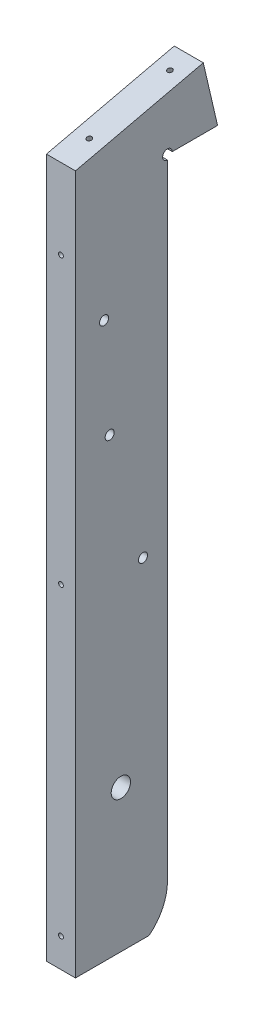
ISO-10303-21;
HEADER;
FILE_DESCRIPTION(('STEP AP214'),'2;1');
FILE_NAME('part.step','',(''),(''),'','','');
FILE_SCHEMA(('AUTOMOTIVE_DESIGN { 1 0 10303 214 1 1 1 1 }'));
ENDSEC;
DATA;
#1=APPLICATION_CONTEXT('core data for automotive mechanical design processes');
#2=APPLICATION_PROTOCOL_DEFINITION('international standard','automotive_design',2000,#1);
#3=PRODUCT_CONTEXT('',#1,'mechanical');
#4=PRODUCT('Part','Part','',(#3));
#5=PRODUCT_RELATED_PRODUCT_CATEGORY('part','',(#4));
#6=PRODUCT_DEFINITION_FORMATION('','',#4);
#7=PRODUCT_DEFINITION_CONTEXT('part definition',#1,'design');
#8=PRODUCT_DEFINITION('design','',#6,#7);
#9=PRODUCT_DEFINITION_SHAPE('','',#8);
#10=(LENGTH_UNIT() NAMED_UNIT(*) SI_UNIT(.MILLI.,.METRE.));
#11=(NAMED_UNIT(*) PLANE_ANGLE_UNIT() SI_UNIT($,.RADIAN.));
#12=(NAMED_UNIT(*) SI_UNIT($,.STERADIAN.) SOLID_ANGLE_UNIT());
#13=UNCERTAINTY_MEASURE_WITH_UNIT(LENGTH_MEASURE(1.E-05),#10,'distance_accuracy_value','');
#14=(GEOMETRIC_REPRESENTATION_CONTEXT(3) GLOBAL_UNCERTAINTY_ASSIGNED_CONTEXT((#13)) GLOBAL_UNIT_ASSIGNED_CONTEXT((#10,
#11,#12)) REPRESENTATION_CONTEXT('',''));
#15=CARTESIAN_POINT('',(0.,0.,0.));
#16=DIRECTION('',(0.,0.,1.));
#17=DIRECTION('',(1.,0.,0.));
#18=AXIS2_PLACEMENT_3D('',#15,#16,#17);
#19=CARTESIAN_POINT('',(-228.088766336441,1.77635683940025E-12,-66.675));
#20=DIRECTION('',(1.,0.,0.));
#21=DIRECTION('',(0.,1.,0.));
#22=AXIS2_PLACEMENT_3D('',#19,#20,#21);
#23=PLANE('',#22);
#24=DIRECTION('',(0.,-1.,0.));
#25=VECTOR('',#24,1.);
#26=CARTESIAN_POINT('',(-228.088766336441,1.77635683940025E-12,0.));
#27=LINE('',#26,#25);
#28=CARTESIAN_POINT('',(-228.088766336441,20.8246330030021,0.));
#29=VERTEX_POINT('',#28);
#30=CARTESIAN_POINT('',(-228.088766336441,-437.642,0.));
#31=VERTEX_POINT('',#30);
#32=EDGE_CURVE('E128',#29,#31,#27,.T.);
#33=ORIENTED_EDGE('',*,*,#32,.F.);
#34=DIRECTION('',(0.,-0.22637333895091,0.974040610761285));
#35=VECTOR('',#34,1.);
#36=CARTESIAN_POINT('',(-228.088766336441,34.8445532417902,-60.325));
#37=LINE('',#36,#35);
#38=CARTESIAN_POINT('',(-228.088766336441,40.3069419106757,-83.8285999376698));
#39=VERTEX_POINT('',#38);
#40=EDGE_CURVE('E210',#39,#29,#37,.T.);
#41=ORIENTED_EDGE('',*,*,#40,.F.);
#42=DIRECTION('',(0.,0.974040610761285,0.226373338950907));
#43=VECTOR('',#42,1.);
#44=CARTESIAN_POINT('',(-228.088766336441,40.3069419106757,-83.8285999376698));
#45=LINE('',#44,#43);
#46=CARTESIAN_POINT('',(-228.088766336441,0.,-93.1961939808879));
#47=VERTEX_POINT('',#46);
#48=EDGE_CURVE('E201',#47,#39,#45,.T.);
#49=ORIENTED_EDGE('',*,*,#48,.F.);
#50=DIRECTION('',(0.,0.,-1.));
#51=VECTOR('',#50,1.);
#52=CARTESIAN_POINT('',(-228.088766336441,0.,-93.1961939808879));
#53=LINE('',#52,#51);
#54=CARTESIAN_POINT('',(-228.088766336441,0.,-63.5));
#55=VERTEX_POINT('',#54);
#56=EDGE_CURVE('E196',#55,#47,#53,.T.);
#57=ORIENTED_EDGE('',*,*,#56,.F.);
#58=CARTESIAN_POINT('',(-228.088766336441,0.,-60.325));
#59=DIRECTION('',(1.,0.,0.));
#60=DIRECTION('',(0.,0.,-1.));
#61=AXIS2_PLACEMENT_3D('',#58,#59,#60);
#62=CIRCLE('',#61,3.175);
#63=CARTESIAN_POINT('',(-228.088766336441,-3.17500000000002,-60.325));
#64=VERTEX_POINT('',#63);
#65=EDGE_CURVE('E151',#55,#64,#62,.T.);
#66=ORIENTED_EDGE('',*,*,#65,.T.);
#67=DIRECTION('',(0.,-1.,0.));
#68=VECTOR('',#67,1.);
#69=CARTESIAN_POINT('',(-228.088766336441,1.77635683940025E-12,-60.325));
#70=LINE('',#69,#68);
#71=CARTESIAN_POINT('',(-228.088766336441,-412.75,-60.325));
#72=VERTEX_POINT('',#71);
#73=EDGE_CURVE('E222',#64,#72,#70,.T.);
#74=ORIENTED_EDGE('',*,*,#73,.T.);
#75=CARTESIAN_POINT('',(-228.088766336441,-412.75,-28.575));
#76=DIRECTION('',(-1.,0.,0.));
#77=DIRECTION('',(0.,-1.,0.));
#78=AXIS2_PLACEMENT_3D('',#75,#76,#77);
#79=CIRCLE('',#78,31.75);
#80=CARTESIAN_POINT('',(-228.088766336441,-437.642,-48.2841561463194));
#81=VERTEX_POINT('',#80);
#82=EDGE_CURVE('E225',#72,#81,#79,.T.);
#83=ORIENTED_EDGE('',*,*,#82,.T.);
#84=DIRECTION('',(0.,0.,1.));
#85=VECTOR('',#84,1.);
#86=CARTESIAN_POINT('',(-228.088766336441,-437.642,0.));
#87=LINE('',#86,#85);
#88=EDGE_CURVE('E137',#81,#31,#87,.T.);
#89=ORIENTED_EDGE('',*,*,#88,.T.);
#90=EDGE_LOOP('',(#33,#41,#49,#57,#66,#74,#83,#89));
#91=FACE_BOUND('',#90,.T.);
#92=CARTESIAN_POINT('',(-228.088766336441,-73.4835711186936,-18.7555467062765));
#93=DIRECTION('',(1.,0.,0.));
#94=DIRECTION('',(0.,0.,-1.));
#95=AXIS2_PLACEMENT_3D('',#92,#93,#94);
#96=CIRCLE('',#95,2.976626);
#97=CARTESIAN_POINT('',(-228.088766336441,-73.4835711186936,-21.7321727062765));
#98=VERTEX_POINT('',#97);
#99=EDGE_CURVE('E251',#98,#98,#96,.T.);
#100=ORIENTED_EDGE('',*,*,#99,.T.);
#101=EDGE_LOOP('',(#100));
#102=FACE_BOUND('',#101,.T.);
#103=CARTESIAN_POINT('',(-228.088766336441,-140.390130184137,-22.4342058235592));
#104=DIRECTION('',(1.,0.,0.));
#105=DIRECTION('',(0.,0.,-1.));
#106=AXIS2_PLACEMENT_3D('',#103,#104,#105);
#107=CIRCLE('',#106,2.97662600000001);
#108=CARTESIAN_POINT('',(-228.088766336441,-140.390130184137,-25.4108318235592));
#109=VERTEX_POINT('',#108);
#110=EDGE_CURVE('E259',#109,#109,#107,.T.);
#111=ORIENTED_EDGE('',*,*,#110,.T.);
#112=EDGE_LOOP('',(#111));
#113=FACE_BOUND('',#112,.T.);
#114=CARTESIAN_POINT('',(-228.088766336441,-221.06944442262,-44.3140248027106));
#115=DIRECTION('',(1.,0.,0.));
#116=DIRECTION('',(0.,0.,-1.));
#117=AXIS2_PLACEMENT_3D('',#114,#115,#116);
#118=CIRCLE('',#117,2.97662600000001);
#119=CARTESIAN_POINT('',(-228.088766336441,-221.06944442262,-47.2906508027106));
#120=VERTEX_POINT('',#119);
#121=EDGE_CURVE('E265',#120,#120,#118,.T.);
#122=ORIENTED_EDGE('',*,*,#121,.T.);
#123=EDGE_LOOP('',(#122));
#124=FACE_BOUND('',#123,.T.);
#125=CARTESIAN_POINT('',(-228.088766336441,-344.263413995719,-29.772711998703));
#126=DIRECTION('',(-1.,0.,0.));
#127=DIRECTION('',(0.,0.,1.));
#128=AXIS2_PLACEMENT_3D('',#125,#126,#127);
#129=CIRCLE('',#128,6.35000000000002);
#130=CARTESIAN_POINT('',(-228.088766336441,-344.263413995719,-23.422711998703));
#131=VERTEX_POINT('',#130);
#132=EDGE_CURVE('E271',#131,#131,#129,.T.);
#133=ORIENTED_EDGE('',*,*,#132,.F.);
#134=EDGE_LOOP('',(#133));
#135=FACE_BOUND('',#134,.T.);
#136=ADVANCED_FACE('F35',(#91,#102,#113,#124,#135),#23,.F.);
#137=CARTESIAN_POINT('',(-209.038766336441,0.,-66.675));
#138=DIRECTION('',(-1.,0.,0.));
#139=DIRECTION('',(0.,-1.,0.));
#140=AXIS2_PLACEMENT_3D('',#137,#138,#139);
#141=PLANE('',#140);
#142=CARTESIAN_POINT('',(-209.038766336441,-344.263413995719,-29.772711998703));
#143=DIRECTION('',(-1.,0.,0.));
#144=DIRECTION('',(0.,-1.,0.));
#145=AXIS2_PLACEMENT_3D('',#142,#143,#144);
#146=CIRCLE('',#145,6.35000000000002);
#147=CARTESIAN_POINT('',(-209.038766336441,-350.613413995719,-29.772711998703));
#148=VERTEX_POINT('',#147);
#149=EDGE_CURVE('E268',#148,#148,#146,.T.);
#150=ORIENTED_EDGE('',*,*,#149,.T.);
#151=EDGE_LOOP('',(#150));
#152=FACE_BOUND('',#151,.T.);
#153=CARTESIAN_POINT('',(-209.038766336441,-221.06944442262,-44.3140248027106));
#154=DIRECTION('',(1.,0.,0.));
#155=DIRECTION('',(0.,-1.,0.));
#156=AXIS2_PLACEMENT_3D('',#153,#154,#155);
#157=CIRCLE('',#156,2.976626);
#158=CARTESIAN_POINT('',(-209.038766336441,-224.04607042262,-44.3140248027106));
#159=VERTEX_POINT('',#158);
#160=EDGE_CURVE('E262',#159,#159,#157,.T.);
#161=ORIENTED_EDGE('',*,*,#160,.F.);
#162=EDGE_LOOP('',(#161));
#163=FACE_BOUND('',#162,.T.);
#164=CARTESIAN_POINT('',(-209.038766336441,-140.390130184137,-22.4342058235592));
#165=DIRECTION('',(1.,0.,0.));
#166=DIRECTION('',(0.,-1.,0.));
#167=AXIS2_PLACEMENT_3D('',#164,#165,#166);
#168=CIRCLE('',#167,2.976626);
#169=CARTESIAN_POINT('',(-209.038766336441,-143.366756184137,-22.4342058235592));
#170=VERTEX_POINT('',#169);
#171=EDGE_CURVE('E256',#170,#170,#168,.T.);
#172=ORIENTED_EDGE('',*,*,#171,.F.);
#173=EDGE_LOOP('',(#172));
#174=FACE_BOUND('',#173,.T.);
#175=CARTESIAN_POINT('',(-209.038766336441,-73.4835711186936,-18.7555467062765));
#176=DIRECTION('',(1.,0.,0.));
#177=DIRECTION('',(0.,-1.,0.));
#178=AXIS2_PLACEMENT_3D('',#175,#176,#177);
#179=CIRCLE('',#178,2.976626);
#180=CARTESIAN_POINT('',(-209.038766336441,-76.4601971186936,-18.7555467062765));
#181=VERTEX_POINT('',#180);
#182=EDGE_CURVE('E248',#181,#181,#179,.T.);
#183=ORIENTED_EDGE('',*,*,#182,.F.);
#184=EDGE_LOOP('',(#183));
#185=FACE_BOUND('',#184,.T.);
#186=CARTESIAN_POINT('',(-209.038766336441,-412.75,-28.575));
#187=DIRECTION('',(1.,0.,0.));
#188=DIRECTION('',(0.,-1.,0.));
#189=AXIS2_PLACEMENT_3D('',#186,#187,#188);
#190=CIRCLE('',#189,31.75);
#191=CARTESIAN_POINT('',(-209.038766336441,-437.642,-48.2841561463194));
#192=VERTEX_POINT('',#191);
#193=CARTESIAN_POINT('',(-209.038766336441,-412.75,-60.325));
#194=VERTEX_POINT('',#193);
#195=EDGE_CURVE('E220',#192,#194,#190,.T.);
#196=ORIENTED_EDGE('',*,*,#195,.T.);
#197=DIRECTION('',(0.,1.,0.));
#198=VECTOR('',#197,1.);
#199=CARTESIAN_POINT('',(-209.038766336441,1.77870238100157E-12,-60.325));
#200=LINE('',#199,#198);
#201=CARTESIAN_POINT('',(-209.038766336441,-3.17500000000002,-60.325));
#202=VERTEX_POINT('',#201);
#203=EDGE_CURVE('E217',#194,#202,#200,.T.);
#204=ORIENTED_EDGE('',*,*,#203,.T.);
#205=CARTESIAN_POINT('',(-209.038766336441,0.,-60.325));
#206=DIRECTION('',(1.,0.,0.));
#207=DIRECTION('',(0.,-1.,0.));
#208=AXIS2_PLACEMENT_3D('',#205,#206,#207);
#209=CIRCLE('',#208,3.175);
#210=CARTESIAN_POINT('',(-209.038766336441,8.23179834482838E-13,-63.5));
#211=VERTEX_POINT('',#210);
#212=EDGE_CURVE('E11',#211,#202,#209,.T.);
#213=ORIENTED_EDGE('',*,*,#212,.F.);
#214=DIRECTION('',(0.,0.,-1.));
#215=VECTOR('',#214,1.);
#216=CARTESIAN_POINT('',(-209.038766336441,0.,-93.1961939808879));
#217=LINE('',#216,#215);
#218=CARTESIAN_POINT('',(-209.038766336441,0.,-93.1961939808879));
#219=VERTEX_POINT('',#218);
#220=EDGE_CURVE('E197',#211,#219,#217,.T.);
#221=ORIENTED_EDGE('',*,*,#220,.T.);
#222=DIRECTION('',(0.,0.974040610761285,0.226373338950907));
#223=VECTOR('',#222,1.);
#224=CARTESIAN_POINT('',(-209.038766336441,40.3069419106757,-83.8285999376698));
#225=LINE('',#224,#223);
#226=CARTESIAN_POINT('',(-209.038766336441,40.3069419106757,-83.8285999376698));
#227=VERTEX_POINT('',#226);
#228=EDGE_CURVE('E200',#219,#227,#225,.T.);
#229=ORIENTED_EDGE('',*,*,#228,.T.);
#230=DIRECTION('',(0.,-0.22637333895091,0.974040610761285));
#231=VECTOR('',#230,1.);
#232=CARTESIAN_POINT('',(-209.038766336441,34.8445532417902,-60.325));
#233=LINE('',#232,#231);
#234=CARTESIAN_POINT('',(-209.038766336441,20.8246330030021,0.));
#235=VERTEX_POINT('',#234);
#236=EDGE_CURVE('E142',#227,#235,#233,.T.);
#237=ORIENTED_EDGE('',*,*,#236,.T.);
#238=DIRECTION('',(0.,1.,0.));
#239=VECTOR('',#238,1.);
#240=CARTESIAN_POINT('',(-209.038766336441,0.,0.));
#241=LINE('',#240,#239);
#242=CARTESIAN_POINT('',(-209.038766336441,-437.642,0.));
#243=VERTEX_POINT('',#242);
#244=EDGE_CURVE('E43',#243,#235,#241,.T.);
#245=ORIENTED_EDGE('',*,*,#244,.F.);
#246=DIRECTION('',(0.,0.,1.));
#247=VECTOR('',#246,1.);
#248=CARTESIAN_POINT('',(-209.038766336441,-437.642,0.));
#249=LINE('',#248,#247);
#250=EDGE_CURVE('E132',#192,#243,#249,.T.);
#251=ORIENTED_EDGE('',*,*,#250,.F.);
#252=EDGE_LOOP('',(#196,#204,#213,#221,#229,#237,#245,#251));
#253=FACE_BOUND('',#252,.T.);
#254=ADVANCED_FACE('F139',(#152,#163,#174,#185,#253),#141,.F.);
#255=CARTESIAN_POINT('',(0.,0.,0.));
#256=DIRECTION('',(0.,0.,-1.));
#257=DIRECTION('',(1.,0.,0.));
#258=AXIS2_PLACEMENT_3D('',#255,#256,#257);
#259=PLANE('',#258);
#260=CARTESIAN_POINT('',(-218.563766336441,-31.7499999999982,0.));
#261=DIRECTION('',(0.,0.,1.));
#262=DIRECTION('',(1.,0.,0.));
#263=AXIS2_PLACEMENT_3D('',#260,#261,#262);
#264=CIRCLE('',#263,1.58749999999999);
#265=CARTESIAN_POINT('',(-216.976266336441,-31.7499999999982,0.));
#266=VERTEX_POINT('',#265);
#267=EDGE_CURVE('E165',#266,#266,#264,.T.);
#268=ORIENTED_EDGE('',*,*,#267,.F.);
#269=EDGE_LOOP('',(#268));
#270=FACE_BOUND('',#269,.T.);
#271=CARTESIAN_POINT('',(-218.563766336441,-218.820999999999,0.));
#272=DIRECTION('',(0.,0.,1.));
#273=DIRECTION('',(1.,0.,0.));
#274=AXIS2_PLACEMENT_3D('',#271,#272,#273);
#275=CIRCLE('',#274,1.58749999999999);
#276=CARTESIAN_POINT('',(-216.976266336441,-218.820999999999,0.));
#277=VERTEX_POINT('',#276);
#278=EDGE_CURVE('E161',#277,#277,#275,.T.);
#279=ORIENTED_EDGE('',*,*,#278,.F.);
#280=EDGE_LOOP('',(#279));
#281=FACE_BOUND('',#280,.T.);
#282=CARTESIAN_POINT('',(-218.563766336441,-418.592,0.));
#283=DIRECTION('',(0.,0.,1.));
#284=DIRECTION('',(1.,0.,0.));
#285=AXIS2_PLACEMENT_3D('',#282,#283,#284);
#286=CIRCLE('',#285,1.58749999999999);
#287=CARTESIAN_POINT('',(-216.976266336441,-418.592,0.));
#288=VERTEX_POINT('',#287);
#289=EDGE_CURVE('E157',#288,#288,#286,.T.);
#290=ORIENTED_EDGE('',*,*,#289,.F.);
#291=EDGE_LOOP('',(#290));
#292=FACE_BOUND('',#291,.T.);
#293=ORIENTED_EDGE('',*,*,#244,.T.);
#294=DIRECTION('',(-1.,0.,0.));
#295=VECTOR('',#294,1.);
#296=CARTESIAN_POINT('',(-209.038766336441,20.8246330030021,0.));
#297=LINE('',#296,#295);
#298=EDGE_CURVE('E213',#235,#29,#297,.T.);
#299=ORIENTED_EDGE('',*,*,#298,.T.);
#300=ORIENTED_EDGE('',*,*,#32,.T.);
#301=DIRECTION('',(-1.,0.,0.));
#302=VECTOR('',#301,1.);
#303=CARTESIAN_POINT('',(-209.038766336441,-437.642,0.));
#304=LINE('',#303,#302);
#305=EDGE_CURVE('E123',#243,#31,#304,.T.);
#306=ORIENTED_EDGE('',*,*,#305,.F.);
#307=EDGE_LOOP('',(#293,#299,#300,#306));
#308=FACE_BOUND('',#307,.T.);
#309=ADVANCED_FACE('F124',(#270,#281,#292,#308),#259,.F.);
#310=CARTESIAN_POINT('',(-209.037766336441,-412.75,-28.575));
#311=DIRECTION('',(-1.,0.,0.));
#312=DIRECTION('',(0.,-1.,0.));
#313=AXIS2_PLACEMENT_3D('',#310,#311,#312);
#314=CYLINDRICAL_SURFACE('',#313,31.75);
#315=ORIENTED_EDGE('',*,*,#82,.F.);
#316=DIRECTION('',(-1.,0.,0.));
#317=VECTOR('',#316,1.);
#318=CARTESIAN_POINT('',(-209.037766336441,-412.75,-60.325));
#319=LINE('',#318,#317);
#320=EDGE_CURVE('E144',#194,#72,#319,.T.);
#321=ORIENTED_EDGE('',*,*,#320,.F.);
#322=ORIENTED_EDGE('',*,*,#195,.F.);
#323=DIRECTION('',(-1.,0.,0.));
#324=VECTOR('',#323,1.);
#325=CARTESIAN_POINT('',(-209.038766336441,-437.642,-48.2841561463194));
#326=LINE('',#325,#324);
#327=EDGE_CURVE('E51',#192,#81,#326,.T.);
#328=ORIENTED_EDGE('',*,*,#327,.T.);
#329=EDGE_LOOP('',(#315,#321,#322,#328));
#330=FACE_BOUND('',#329,.T.);
#331=ADVANCED_FACE('F230',(#330),#314,.T.);
#332=CARTESIAN_POINT('',(-209.037766336441,1.77870250412711E-12,-60.325));
#333=DIRECTION('',(0.,0.,1.));
#334=DIRECTION('',(0.,1.,0.));
#335=AXIS2_PLACEMENT_3D('',#332,#333,#334);
#336=PLANE('',#335);
#337=CARTESIAN_POINT('',(-218.563766336441,-266.700000000001,-60.325));
#338=DIRECTION('',(0.,0.,-1.));
#339=DIRECTION('',(0.,1.,0.));
#340=AXIS2_PLACEMENT_3D('',#337,#338,#339);
#341=CIRCLE('',#340,1.58749999999999);
#342=CARTESIAN_POINT('',(-218.563766336441,-265.112500000001,-60.325));
#343=VERTEX_POINT('',#342);
#344=EDGE_CURVE('E38',#343,#343,#341,.T.);
#345=ORIENTED_EDGE('',*,*,#344,.F.);
#346=EDGE_LOOP('',(#345));
#347=FACE_BOUND('',#346,.T.);
#348=CARTESIAN_POINT('',(-218.563766336441,-41.275,-60.325));
#349=DIRECTION('',(0.,0.,-1.));
#350=DIRECTION('',(0.,1.,0.));
#351=AXIS2_PLACEMENT_3D('',#348,#349,#350);
#352=CIRCLE('',#351,1.58749999999999);
#353=CARTESIAN_POINT('',(-218.563766336441,-39.6875,-60.325));
#354=VERTEX_POINT('',#353);
#355=EDGE_CURVE('E168',#354,#354,#352,.T.);
#356=ORIENTED_EDGE('',*,*,#355,.F.);
#357=EDGE_LOOP('',(#356));
#358=FACE_BOUND('',#357,.T.);
#359=ORIENTED_EDGE('',*,*,#203,.F.);
#360=ORIENTED_EDGE('',*,*,#320,.T.);
#361=ORIENTED_EDGE('',*,*,#73,.F.);
#362=DIRECTION('',(-1.,0.,0.));
#363=VECTOR('',#362,1.);
#364=CARTESIAN_POINT('',(-228.088766336441,-3.17500000000002,-60.325));
#365=LINE('',#364,#363);
#366=EDGE_CURVE('E59',#202,#64,#365,.T.);
#367=ORIENTED_EDGE('',*,*,#366,.F.);
#368=EDGE_LOOP('',(#359,#360,#361,#367));
#369=FACE_BOUND('',#368,.T.);
#370=ADVANCED_FACE('F228',(#347,#358,#369),#336,.F.);
#371=CARTESIAN_POINT('',(-209.038766336441,34.8445532417902,-60.325));
#372=DIRECTION('',(0.,0.974040610761285,0.22637333895091));
#373=DIRECTION('',(0.,0.22637333895091,-0.974040610761285));
#374=AXIS2_PLACEMENT_3D('',#371,#372,#373);
#375=PLANE('',#374);
#376=CARTESIAN_POINT('',(-218.563766336441,37.4320005059991,-71.4582841810015));
#377=DIRECTION('',(0.,-0.974040610761285,-0.22637333895091));
#378=DIRECTION('',(0.,0.22637333895091,-0.974040610761285));
#379=AXIS2_PLACEMENT_3D('',#376,#377,#378);
#380=CIRCLE('',#379,1.58749999999999);
#381=CARTESIAN_POINT('',(-218.563766336441,37.7913681815837,-73.004573650585));
#382=VERTEX_POINT('',#381);
#383=EDGE_CURVE('E153',#382,#382,#380,.T.);
#384=ORIENTED_EDGE('',*,*,#383,.T.);
#385=EDGE_LOOP('',(#384));
#386=FACE_BOUND('',#385,.T.);
#387=CARTESIAN_POINT('',(-218.563766336441,25.137045110017,-18.5554736350028));
#388=DIRECTION('',(0.,-0.974040610761285,-0.22637333895091));
#389=DIRECTION('',(0.,0.22637333895091,-0.974040610761285));
#390=AXIS2_PLACEMENT_3D('',#387,#388,#389);
#391=CIRCLE('',#390,1.58749999999999);
#392=CARTESIAN_POINT('',(-218.563766336441,25.4964127856015,-20.1017631045863));
#393=VERTEX_POINT('',#392);
#394=EDGE_CURVE('E148',#393,#393,#391,.T.);
#395=ORIENTED_EDGE('',*,*,#394,.T.);
#396=EDGE_LOOP('',(#395));
#397=FACE_BOUND('',#396,.T.);
#398=ORIENTED_EDGE('',*,*,#40,.T.);
#399=ORIENTED_EDGE('',*,*,#298,.F.);
#400=ORIENTED_EDGE('',*,*,#236,.F.);
#401=DIRECTION('',(-1.,0.,0.));
#402=VECTOR('',#401,1.);
#403=CARTESIAN_POINT('',(-209.038766336441,40.3069419106757,-83.8285999376698));
#404=LINE('',#403,#402);
#405=EDGE_CURVE('E208',#227,#39,#404,.T.);
#406=ORIENTED_EDGE('',*,*,#405,.T.);
#407=EDGE_LOOP('',(#398,#399,#400,#406));
#408=FACE_BOUND('',#407,.T.);
#409=ADVANCED_FACE('F247',(#386,#397,#408),#375,.T.);
#410=CARTESIAN_POINT('',(-209.038766336441,40.3069419106757,-83.8285999376698));
#411=DIRECTION('',(0.,0.226373338950907,-0.974040610761285));
#412=DIRECTION('',(0.,-0.974040610761285,-0.226373338950907));
#413=AXIS2_PLACEMENT_3D('',#410,#411,#412);
#414=PLANE('',#413);
#415=ORIENTED_EDGE('',*,*,#48,.T.);
#416=ORIENTED_EDGE('',*,*,#405,.F.);
#417=ORIENTED_EDGE('',*,*,#228,.F.);
#418=DIRECTION('',(-1.,0.,0.));
#419=VECTOR('',#418,1.);
#420=CARTESIAN_POINT('',(-209.038766336441,0.,-93.1961939808879));
#421=LINE('',#420,#419);
#422=EDGE_CURVE('E203',#219,#47,#421,.T.);
#423=ORIENTED_EDGE('',*,*,#422,.T.);
#424=EDGE_LOOP('',(#415,#416,#417,#423));
#425=FACE_BOUND('',#424,.T.);
#426=ADVANCED_FACE('F244',(#425),#414,.T.);
#427=CARTESIAN_POINT('',(-209.038766336441,0.,-93.1961939808879));
#428=DIRECTION('',(0.,-1.,0.));
#429=DIRECTION('',(0.,0.,1.));
#430=AXIS2_PLACEMENT_3D('',#427,#428,#429);
#431=PLANE('',#430);
#432=DIRECTION('',(-1.,0.,0.));
#433=VECTOR('',#432,1.);
#434=CARTESIAN_POINT('',(-228.088766336441,8.20834292881518E-13,-63.5));
#435=LINE('',#434,#433);
#436=EDGE_CURVE('E193',#211,#55,#435,.T.);
#437=ORIENTED_EDGE('',*,*,#436,.T.);
#438=ORIENTED_EDGE('',*,*,#56,.T.);
#439=ORIENTED_EDGE('',*,*,#422,.F.);
#440=ORIENTED_EDGE('',*,*,#220,.F.);
#441=EDGE_LOOP('',(#437,#438,#439,#440));
#442=FACE_BOUND('',#441,.T.);
#443=ADVANCED_FACE('F242',(#442),#431,.T.);
#444=CARTESIAN_POINT('',(-228.088766336441,0.,-60.325));
#445=DIRECTION('',(-1.,0.,0.));
#446=DIRECTION('',(0.,0.,-1.));
#447=AXIS2_PLACEMENT_3D('',#444,#445,#446);
#448=CYLINDRICAL_SURFACE('',#447,3.175);
#449=ORIENTED_EDGE('',*,*,#212,.T.);
#450=ORIENTED_EDGE('',*,*,#366,.T.);
#451=ORIENTED_EDGE('',*,*,#65,.F.);
#452=ORIENTED_EDGE('',*,*,#436,.F.);
#453=EDGE_LOOP('',(#449,#450,#451,#452));
#454=FACE_BOUND('',#453,.T.);
#455=ADVANCED_FACE('F237',(#454),#448,.F.);
#456=CARTESIAN_POINT('',(-218.563766336441,6.58157147501348,-22.8678857420179));
#457=DIRECTION('',(0.,0.974040610761284,0.226373338950912));
#458=DIRECTION('',(0.,0.226373338950912,-0.974040610761284));
#459=AXIS2_PLACEMENT_3D('',#456,#457,#458);
#460=CONICAL_SURFACE('',#459,1.58749999999999,1.02974425867665);
#461=CARTESIAN_POINT('',(-218.563766336441,5.65246702712373,-23.0838156260281));
#462=VERTEX_POINT('',#461);
#463=VERTEX_LOOP('',#462);
#464=FACE_BOUND('',#463,.T.);
#465=CARTESIAN_POINT('',(-218.563766336441,6.58157147501348,-22.8678857420179));
#466=DIRECTION('',(0.,-0.974040610761284,-0.226373338950912));
#467=DIRECTION('',(0.,0.226373338950912,-0.974040610761284));
#468=AXIS2_PLACEMENT_3D('',#465,#466,#467);
#469=CIRCLE('',#468,1.58749999999999);
#470=CARTESIAN_POINT('',(-218.563766336441,6.94093915059805,-24.4141752116014));
#471=VERTEX_POINT('',#470);
#472=EDGE_CURVE('E152',#471,#471,#469,.T.);
#473=ORIENTED_EDGE('',*,*,#472,.F.);
#474=EDGE_LOOP('',(#473));
#475=FACE_BOUND('',#474,.T.);
#476=ADVANCED_FACE('F303',(#464,#475),#460,.F.);
#477=CARTESIAN_POINT('',(-218.563766336441,56.0628345016867,-11.3681201233116));
#478=DIRECTION('',(0.,0.974040610761284,0.226373338950912));
#479=DIRECTION('',(0.,0.226373338950912,-0.974040610761284));
#480=AXIS2_PLACEMENT_3D('',#477,#478,#479);
#481=CYLINDRICAL_SURFACE('',#480,1.58749999999999);
#482=ORIENTED_EDGE('',*,*,#394,.F.);
#483=EDGE_LOOP('',(#482));
#484=FACE_BOUND('',#483,.T.);
#485=ORIENTED_EDGE('',*,*,#472,.T.);
#486=EDGE_LOOP('',(#485));
#487=FACE_BOUND('',#486,.T.);
#488=ADVANCED_FACE('F306',(#484,#487),#481,.F.);
#489=CARTESIAN_POINT('',(-218.563766336441,18.8765268709957,-75.7706962880166));
#490=DIRECTION('',(0.,0.974040610761284,0.226373338950912));
#491=DIRECTION('',(0.,0.226373338950912,-0.974040610761284));
#492=AXIS2_PLACEMENT_3D('',#489,#490,#491);
#493=CONICAL_SURFACE('',#492,1.58749999999999,1.02974425867665);
#494=CARTESIAN_POINT('',(-218.563766336441,17.9474224231059,-75.9866261720268));
#495=VERTEX_POINT('',#494);
#496=VERTEX_LOOP('',#495);
#497=FACE_BOUND('',#496,.T.);
#498=CARTESIAN_POINT('',(-218.563766336441,18.8765268709957,-75.7706962880166));
#499=DIRECTION('',(0.,-0.974040610761284,-0.226373338950912));
#500=DIRECTION('',(0.,0.226373338950912,-0.974040610761284));
#501=AXIS2_PLACEMENT_3D('',#498,#499,#500);
#502=CIRCLE('',#501,1.58749999999999);
#503=CARTESIAN_POINT('',(-218.563766336441,19.2358945465802,-77.3169857576001));
#504=VERTEX_POINT('',#503);
#505=EDGE_CURVE('E156',#504,#504,#502,.T.);
#506=ORIENTED_EDGE('',*,*,#505,.F.);
#507=EDGE_LOOP('',(#506));
#508=FACE_BOUND('',#507,.T.);
#509=ADVANCED_FACE('F310',(#497,#508),#493,.F.);
#510=CARTESIAN_POINT('',(-218.563766336441,68.3577898976689,-64.2709306693103));
#511=DIRECTION('',(0.,0.974040610761284,0.226373338950912));
#512=DIRECTION('',(0.,0.226373338950912,-0.974040610761284));
#513=AXIS2_PLACEMENT_3D('',#510,#511,#512);
#514=CYLINDRICAL_SURFACE('',#513,1.58749999999999);
#515=ORIENTED_EDGE('',*,*,#383,.F.);
#516=EDGE_LOOP('',(#515));
#517=FACE_BOUND('',#516,.T.);
#518=ORIENTED_EDGE('',*,*,#505,.T.);
#519=EDGE_LOOP('',(#518));
#520=FACE_BOUND('',#519,.T.);
#521=ADVANCED_FACE('F314',(#517,#520),#514,.F.);
#522=CARTESIAN_POINT('',(-218.563766336441,-418.592,25.4));
#523=DIRECTION('',(0.,0.,1.));
#524=DIRECTION('',(-1.,0.,0.));
#525=AXIS2_PLACEMENT_3D('',#522,#523,#524);
#526=CYLINDRICAL_SURFACE('',#525,1.58749999999999);
#527=CARTESIAN_POINT('',(-218.563766336441,-418.592,-12.7));
#528=DIRECTION('',(0.,0.,-1.));
#529=DIRECTION('',(-1.,0.,0.));
#530=AXIS2_PLACEMENT_3D('',#527,#528,#529);
#531=CIRCLE('',#530,1.58749999999999);
#532=CARTESIAN_POINT('',(-220.151266336441,-418.592,-12.7));
#533=VERTEX_POINT('',#532);
#534=EDGE_CURVE('E160',#533,#533,#531,.T.);
#535=ORIENTED_EDGE('',*,*,#534,.T.);
#536=EDGE_LOOP('',(#535));
#537=FACE_BOUND('',#536,.T.);
#538=ORIENTED_EDGE('',*,*,#289,.T.);
#539=EDGE_LOOP('',(#538));
#540=FACE_BOUND('',#539,.T.);
#541=ADVANCED_FACE('F318',(#537,#540),#526,.F.);
#542=CARTESIAN_POINT('',(-218.563766336441,-418.592,-12.7));
#543=DIRECTION('',(0.,0.,1.));
#544=DIRECTION('',(-1.,0.,0.));
#545=AXIS2_PLACEMENT_3D('',#542,#543,#544);
#546=CONICAL_SURFACE('',#545,1.58749999999999,1.02974425867665);
#547=CARTESIAN_POINT('',(-218.563766336441,-418.592,-13.6538662327062));
#548=VERTEX_POINT('',#547);
#549=VERTEX_LOOP('',#548);
#550=FACE_BOUND('',#549,.T.);
#551=ORIENTED_EDGE('',*,*,#534,.F.);
#552=EDGE_LOOP('',(#551));
#553=FACE_BOUND('',#552,.T.);
#554=ADVANCED_FACE('F320',(#550,#553),#546,.F.);
#555=CARTESIAN_POINT('',(-218.563766336441,-218.820999999999,25.4));
#556=DIRECTION('',(0.,0.,1.));
#557=DIRECTION('',(-1.,0.,0.));
#558=AXIS2_PLACEMENT_3D('',#555,#556,#557);
#559=CYLINDRICAL_SURFACE('',#558,1.58749999999999);
#560=CARTESIAN_POINT('',(-218.563766336441,-218.820999999999,-12.7));
#561=DIRECTION('',(0.,0.,-1.));
#562=DIRECTION('',(-1.,0.,0.));
#563=AXIS2_PLACEMENT_3D('',#560,#561,#562);
#564=CIRCLE('',#563,1.58749999999999);
#565=CARTESIAN_POINT('',(-220.151266336441,-218.820999999999,-12.7));
#566=VERTEX_POINT('',#565);
#567=EDGE_CURVE('E164',#566,#566,#564,.T.);
#568=ORIENTED_EDGE('',*,*,#567,.T.);
#569=EDGE_LOOP('',(#568));
#570=FACE_BOUND('',#569,.T.);
#571=ORIENTED_EDGE('',*,*,#278,.T.);
#572=EDGE_LOOP('',(#571));
#573=FACE_BOUND('',#572,.T.);
#574=ADVANCED_FACE('F323',(#570,#573),#559,.F.);
#575=CARTESIAN_POINT('',(-218.563766336441,-218.820999999999,-12.7));
#576=DIRECTION('',(0.,0.,1.));
#577=DIRECTION('',(-1.,0.,0.));
#578=AXIS2_PLACEMENT_3D('',#575,#576,#577);
#579=CONICAL_SURFACE('',#578,1.58749999999999,1.02974425867665);
#580=CARTESIAN_POINT('',(-218.563766336441,-218.820999999999,-13.6538662327062));
#581=VERTEX_POINT('',#580);
#582=VERTEX_LOOP('',#581);
#583=FACE_BOUND('',#582,.T.);
#584=ORIENTED_EDGE('',*,*,#567,.F.);
#585=EDGE_LOOP('',(#584));
#586=FACE_BOUND('',#585,.T.);
#587=ADVANCED_FACE('F328',(#583,#586),#579,.F.);
#588=CARTESIAN_POINT('',(-218.563766336441,-31.7499999999982,25.4));
#589=DIRECTION('',(0.,0.,1.));
#590=DIRECTION('',(-1.,0.,0.));
#591=AXIS2_PLACEMENT_3D('',#588,#589,#590);
#592=CYLINDRICAL_SURFACE('',#591,1.58749999999999);
#593=CARTESIAN_POINT('',(-218.563766336441,-31.7499999999982,-12.7));
#594=DIRECTION('',(0.,0.,-1.));
#595=DIRECTION('',(-1.,0.,0.));
#596=AXIS2_PLACEMENT_3D('',#593,#594,#595);
#597=CIRCLE('',#596,1.58749999999999);
#598=CARTESIAN_POINT('',(-220.151266336441,-31.7499999999982,-12.7));
#599=VERTEX_POINT('',#598);
#600=EDGE_CURVE('E167',#599,#599,#597,.T.);
#601=ORIENTED_EDGE('',*,*,#600,.T.);
#602=EDGE_LOOP('',(#601));
#603=FACE_BOUND('',#602,.T.);
#604=ORIENTED_EDGE('',*,*,#267,.T.);
#605=EDGE_LOOP('',(#604));
#606=FACE_BOUND('',#605,.T.);
#607=ADVANCED_FACE('F331',(#603,#606),#592,.F.);
#608=CARTESIAN_POINT('',(-218.563766336441,-31.7499999999982,-12.7));
#609=DIRECTION('',(0.,0.,1.));
#610=DIRECTION('',(-1.,0.,0.));
#611=AXIS2_PLACEMENT_3D('',#608,#609,#610);
#612=CONICAL_SURFACE('',#611,1.58749999999999,1.02974425867665);
#613=CARTESIAN_POINT('',(-218.563766336441,-31.7499999999982,-13.6538662327062));
#614=VERTEX_POINT('',#613);
#615=VERTEX_LOOP('',#614);
#616=FACE_BOUND('',#615,.T.);
#617=ORIENTED_EDGE('',*,*,#600,.F.);
#618=EDGE_LOOP('',(#617));
#619=FACE_BOUND('',#618,.T.);
#620=ADVANCED_FACE('F336',(#616,#619),#612,.F.);
#621=CARTESIAN_POINT('',(-218.563766336441,-41.275,-66.6749999999975));
#622=DIRECTION('',(0.,0.,-1.));
#623=DIRECTION('',(1.,0.,0.));
#624=AXIS2_PLACEMENT_3D('',#621,#622,#623);
#625=CYLINDRICAL_SURFACE('',#624,1.58749999999999);
#626=CARTESIAN_POINT('',(-218.563766336441,-41.275,-28.5749999999975));
#627=DIRECTION('',(0.,0.,1.));
#628=DIRECTION('',(1.,0.,0.));
#629=AXIS2_PLACEMENT_3D('',#626,#627,#628);
#630=CIRCLE('',#629,1.58749999999999);
#631=CARTESIAN_POINT('',(-216.976266336441,-41.275,-28.5749999999975));
#632=VERTEX_POINT('',#631);
#633=EDGE_CURVE('E170',#632,#632,#630,.T.);
#634=ORIENTED_EDGE('',*,*,#633,.T.);
#635=EDGE_LOOP('',(#634));
#636=FACE_BOUND('',#635,.T.);
#637=ORIENTED_EDGE('',*,*,#355,.T.);
#638=EDGE_LOOP('',(#637));
#639=FACE_BOUND('',#638,.T.);
#640=ADVANCED_FACE('F339',(#636,#639),#625,.F.);
#641=CARTESIAN_POINT('',(-218.563766336441,-41.275,-28.5749999999975));
#642=DIRECTION('',(0.,0.,-1.));
#643=DIRECTION('',(1.,0.,0.));
#644=AXIS2_PLACEMENT_3D('',#641,#642,#643);
#645=CONICAL_SURFACE('',#644,1.58749999999999,1.02974425867665);
#646=CARTESIAN_POINT('',(-218.563766336441,-41.275,-27.6211337672912));
#647=VERTEX_POINT('',#646);
#648=VERTEX_LOOP('',#647);
#649=FACE_BOUND('',#648,.T.);
#650=ORIENTED_EDGE('',*,*,#633,.F.);
#651=EDGE_LOOP('',(#650));
#652=FACE_BOUND('',#651,.T.);
#653=ADVANCED_FACE('F344',(#649,#652),#645,.F.);
#654=CARTESIAN_POINT('',(-218.563766336441,-266.700000000001,-66.6749999999975));
#655=DIRECTION('',(0.,0.,-1.));
#656=DIRECTION('',(1.,0.,0.));
#657=AXIS2_PLACEMENT_3D('',#654,#655,#656);
#658=CYLINDRICAL_SURFACE('',#657,1.58749999999999);
#659=CARTESIAN_POINT('',(-218.563766336441,-266.700000000001,-28.5749999999975));
#660=DIRECTION('',(0.,0.,1.));
#661=DIRECTION('',(1.,0.,0.));
#662=AXIS2_PLACEMENT_3D('',#659,#660,#661);
#663=CIRCLE('',#662,1.58749999999999);
#664=CARTESIAN_POINT('',(-216.976266336441,-266.700000000001,-28.5749999999975));
#665=VERTEX_POINT('',#664);
#666=EDGE_CURVE('E130',#665,#665,#663,.T.);
#667=ORIENTED_EDGE('',*,*,#666,.T.);
#668=EDGE_LOOP('',(#667));
#669=FACE_BOUND('',#668,.T.);
#670=ORIENTED_EDGE('',*,*,#344,.T.);
#671=EDGE_LOOP('',(#670));
#672=FACE_BOUND('',#671,.T.);
#673=ADVANCED_FACE('F347',(#669,#672),#658,.F.);
#674=CARTESIAN_POINT('',(-218.563766336441,-266.700000000001,-28.5749999999975));
#675=DIRECTION('',(0.,0.,-1.));
#676=DIRECTION('',(1.,0.,0.));
#677=AXIS2_PLACEMENT_3D('',#674,#675,#676);
#678=CONICAL_SURFACE('',#677,1.58749999999999,1.02974425867665);
#679=CARTESIAN_POINT('',(-218.563766336441,-266.700000000001,-27.6211337672912));
#680=VERTEX_POINT('',#679);
#681=VERTEX_LOOP('',#680);
#682=FACE_BOUND('',#681,.T.);
#683=ORIENTED_EDGE('',*,*,#666,.F.);
#684=EDGE_LOOP('',(#683));
#685=FACE_BOUND('',#684,.T.);
#686=ADVANCED_FACE('F351',(#682,#685),#678,.F.);
#687=CARTESIAN_POINT('',(-209.038766336441,-437.642,0.));
#688=DIRECTION('',(0.,1.,0.));
#689=DIRECTION('',(-1.,0.,0.));
#690=AXIS2_PLACEMENT_3D('',#687,#688,#689);
#691=PLANE('',#690);
#692=ORIENTED_EDGE('',*,*,#88,.F.);
#693=ORIENTED_EDGE('',*,*,#327,.F.);
#694=ORIENTED_EDGE('',*,*,#250,.T.);
#695=ORIENTED_EDGE('',*,*,#305,.T.);
#696=EDGE_LOOP('',(#692,#693,#694,#695));
#697=FACE_BOUND('',#696,.T.);
#698=ADVANCED_FACE('F133',(#697),#691,.F.);
#699=CARTESIAN_POINT('',(-228.088766336441,-73.4835711186936,-18.7555467062765));
#700=DIRECTION('',(-1.,0.,0.));
#701=DIRECTION('',(0.,0.,-1.));
#702=AXIS2_PLACEMENT_3D('',#699,#700,#701);
#703=CYLINDRICAL_SURFACE('',#702,2.976626);
#704=ORIENTED_EDGE('',*,*,#182,.T.);
#705=EDGE_LOOP('',(#704));
#706=FACE_BOUND('',#705,.T.);
#707=ORIENTED_EDGE('',*,*,#99,.F.);
#708=EDGE_LOOP('',(#707));
#709=FACE_BOUND('',#708,.T.);
#710=ADVANCED_FACE('F360',(#706,#709),#703,.F.);
#711=CARTESIAN_POINT('',(-228.088766336441,-140.390130184137,-22.4342058235592));
#712=DIRECTION('',(-1.,0.,0.));
#713=DIRECTION('',(0.,0.,-1.));
#714=AXIS2_PLACEMENT_3D('',#711,#712,#713);
#715=CYLINDRICAL_SURFACE('',#714,2.976626);
#716=ORIENTED_EDGE('',*,*,#171,.T.);
#717=EDGE_LOOP('',(#716));
#718=FACE_BOUND('',#717,.T.);
#719=ORIENTED_EDGE('',*,*,#110,.F.);
#720=EDGE_LOOP('',(#719));
#721=FACE_BOUND('',#720,.T.);
#722=ADVANCED_FACE('F363',(#718,#721),#715,.F.);
#723=CARTESIAN_POINT('',(-228.088766336441,-221.06944442262,-44.3140248027106));
#724=DIRECTION('',(-1.,0.,0.));
#725=DIRECTION('',(0.,0.,-1.));
#726=AXIS2_PLACEMENT_3D('',#723,#724,#725);
#727=CYLINDRICAL_SURFACE('',#726,2.976626);
#728=ORIENTED_EDGE('',*,*,#160,.T.);
#729=EDGE_LOOP('',(#728));
#730=FACE_BOUND('',#729,.T.);
#731=ORIENTED_EDGE('',*,*,#121,.F.);
#732=EDGE_LOOP('',(#731));
#733=FACE_BOUND('',#732,.T.);
#734=ADVANCED_FACE('F367',(#730,#733),#727,.F.);
#735=CARTESIAN_POINT('',(-228.088766336441,-344.263413995719,-29.772711998703));
#736=DIRECTION('',(-1.,0.,0.));
#737=DIRECTION('',(0.,0.,1.));
#738=AXIS2_PLACEMENT_3D('',#735,#736,#737);
#739=CYLINDRICAL_SURFACE('',#738,6.35000000000002);
#740=ORIENTED_EDGE('',*,*,#149,.F.);
#741=EDGE_LOOP('',(#740));
#742=FACE_BOUND('',#741,.T.);
#743=ORIENTED_EDGE('',*,*,#132,.T.);
#744=EDGE_LOOP('',(#743));
#745=FACE_BOUND('',#744,.T.);
#746=ADVANCED_FACE('F275',(#742,#745),#739,.F.);
#747=CLOSED_SHELL('',(#136,#254,#309,#331,#370,#409,#426,#443,#455,#476,#488,#509,#521,#541,
#554,#574,#587,#607,#620,#640,#653,#673,#686,#698,#710,#722,#734,#746));
#748=MANIFOLD_SOLID_BREP('B2',#747);
#749=ADVANCED_BREP_SHAPE_REPRESENTATION('',(#18,#748),#14);
#750=SHAPE_DEFINITION_REPRESENTATION(#9,#749);
ENDSEC;
END-ISO-10303-21;
